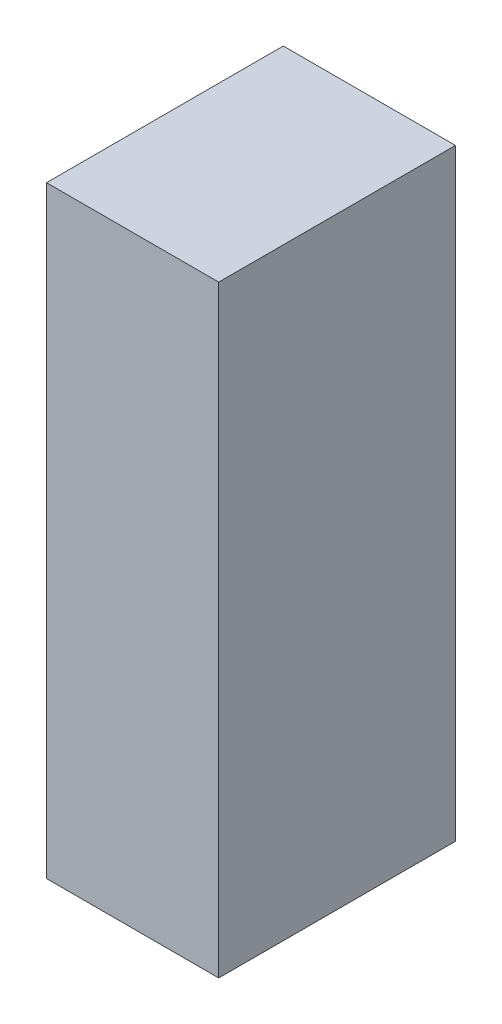
ISO-10303-21;
HEADER;
FILE_DESCRIPTION(('STEP AP214'),'2;1');
FILE_NAME('part.step','',(''),(''),'','','');
FILE_SCHEMA(('AUTOMOTIVE_DESIGN { 1 0 10303 214 1 1 1 1 }'));
ENDSEC;
DATA;
#1=APPLICATION_CONTEXT('core data for automotive mechanical design processes');
#2=APPLICATION_PROTOCOL_DEFINITION('international standard','automotive_design',2000,#1);
#3=PRODUCT_CONTEXT('',#1,'mechanical');
#4=PRODUCT('Part','Part','',(#3));
#5=PRODUCT_RELATED_PRODUCT_CATEGORY('part','',(#4));
#6=PRODUCT_DEFINITION_FORMATION('','',#4);
#7=PRODUCT_DEFINITION_CONTEXT('part definition',#1,'design');
#8=PRODUCT_DEFINITION('design','',#6,#7);
#9=PRODUCT_DEFINITION_SHAPE('','',#8);
#10=(LENGTH_UNIT() NAMED_UNIT(*) SI_UNIT(.MILLI.,.METRE.));
#11=(NAMED_UNIT(*) PLANE_ANGLE_UNIT() SI_UNIT($,.RADIAN.));
#12=(NAMED_UNIT(*) SI_UNIT($,.STERADIAN.) SOLID_ANGLE_UNIT());
#13=UNCERTAINTY_MEASURE_WITH_UNIT(LENGTH_MEASURE(1.E-05),#10,'distance_accuracy_value','');
#14=(GEOMETRIC_REPRESENTATION_CONTEXT(3) GLOBAL_UNCERTAINTY_ASSIGNED_CONTEXT((#13)) GLOBAL_UNIT_ASSIGNED_CONTEXT((#10,
#11,#12)) REPRESENTATION_CONTEXT('',''));
#15=CARTESIAN_POINT('',(0.,0.,0.));
#16=DIRECTION('',(0.,0.,1.));
#17=DIRECTION('',(1.,0.,0.));
#18=AXIS2_PLACEMENT_3D('',#15,#16,#17);
#19=CARTESIAN_POINT('',(-0.20000468,0.6999986,0.));
#20=DIRECTION('',(0.999999999993417,3.62859185820151E-06,0.));
#21=DIRECTION('',(-3.62859185820151E-06,0.999999999993417,0.));
#22=AXIS2_PLACEMENT_3D('',#19,#20,#21);
#23=PLANE('',#22);
#24=DIRECTION('',(0.,0.,1.));
#25=VECTOR('',#24,1.);
#26=CARTESIAN_POINT('',(-0.1999996,-0.69999352,0.));
#27=LINE('',#26,#25);
#28=CARTESIAN_POINT('',(-0.199999599999996,-0.69999352,0.));
#29=VERTEX_POINT('',#28);
#30=CARTESIAN_POINT('',(-0.199999599999996,-0.69999352,0.5499989));
#31=VERTEX_POINT('',#30);
#32=EDGE_CURVE('E62',#29,#31,#27,.T.);
#33=ORIENTED_EDGE('',*,*,#32,.T.);
#34=DIRECTION('',(-3.62859185820151E-06,0.999999999993417,0.));
#35=VECTOR('',#34,1.);
#36=CARTESIAN_POINT('',(-0.20000468,0.6999986,0.5499989));
#37=LINE('',#36,#35);
#38=CARTESIAN_POINT('',(-0.20000468,0.699998600000003,0.5499989));
#39=VERTEX_POINT('',#38);
#40=EDGE_CURVE('E70',#31,#39,#37,.T.);
#41=ORIENTED_EDGE('',*,*,#40,.T.);
#42=DIRECTION('',(0.,0.,1.));
#43=VECTOR('',#42,1.);
#44=CARTESIAN_POINT('',(-0.20000468,0.699998600000003,0.));
#45=LINE('',#44,#43);
#46=CARTESIAN_POINT('',(-0.20000468,0.699998600000003,0.));
#47=VERTEX_POINT('',#46);
#48=EDGE_CURVE('E68',#39,#47,#45,.F.);
#49=ORIENTED_EDGE('',*,*,#48,.T.);
#50=DIRECTION('',(-3.62859185820151E-06,0.999999999993417,0.));
#51=VECTOR('',#50,1.);
#52=CARTESIAN_POINT('',(-0.20000468,0.6999986,0.));
#53=LINE('',#52,#51);
#54=EDGE_CURVE('E69',#29,#47,#53,.T.);
#55=ORIENTED_EDGE('',*,*,#54,.F.);
#56=EDGE_LOOP('',(#33,#41,#49,#55));
#57=FACE_BOUND('',#56,.T.);
#58=ADVANCED_FACE('F17',(#57),#23,.F.);
#59=CARTESIAN_POINT('',(-0.1999996,-0.69999352,0.));
#60=DIRECTION('',(1.90497961767115E-05,0.999999999818553,0.));
#61=DIRECTION('',(-0.999999999818553,1.90497961767115E-05,0.));
#62=AXIS2_PLACEMENT_3D('',#59,#60,#61);
#63=PLANE('',#62);
#64=DIRECTION('',(0.,0.,1.));
#65=VECTOR('',#64,1.);
#66=CARTESIAN_POINT('',(0.20000468,-0.70000114,0.));
#67=LINE('',#66,#65);
#68=CARTESIAN_POINT('',(0.20000468,-0.700001140000003,0.));
#69=VERTEX_POINT('',#68);
#70=CARTESIAN_POINT('',(0.20000468,-0.700001140000003,0.5499989));
#71=VERTEX_POINT('',#70);
#72=EDGE_CURVE('E57',#69,#71,#67,.T.);
#73=ORIENTED_EDGE('',*,*,#72,.T.);
#74=DIRECTION('',(-0.999999999818553,1.90497961767115E-05,0.));
#75=VECTOR('',#74,1.);
#76=CARTESIAN_POINT('',(-0.1999996,-0.69999352,0.5499989));
#77=LINE('',#76,#75);
#78=EDGE_CURVE('E20',#71,#31,#77,.T.);
#79=ORIENTED_EDGE('',*,*,#78,.T.);
#80=ORIENTED_EDGE('',*,*,#32,.F.);
#81=DIRECTION('',(-0.999999999818553,1.90497961767115E-05,0.));
#82=VECTOR('',#81,1.);
#83=CARTESIAN_POINT('',(-0.1999996,-0.69999352,0.));
#84=LINE('',#83,#82);
#85=EDGE_CURVE('E76',#69,#29,#84,.T.);
#86=ORIENTED_EDGE('',*,*,#85,.F.);
#87=EDGE_LOOP('',(#73,#79,#80,#86));
#88=FACE_BOUND('',#87,.T.);
#89=ADVANCED_FACE('F89',(#88),#63,.F.);
#90=CARTESIAN_POINT('',(-0.20000468,0.6999986,0.5499989));
#91=DIRECTION('',(0.,0.,-1.));
#92=DIRECTION('',(-1.,0.,0.));
#93=AXIS2_PLACEMENT_3D('',#90,#91,#92);
#94=PLANE('',#93);
#95=ORIENTED_EDGE('',*,*,#78,.F.);
#96=DIRECTION('',(-3.62856551488351E-06,0.999999999993417,0.));
#97=VECTOR('',#96,1.);
#98=CARTESIAN_POINT('',(0.199999600003956,0.700000051441736,0.5499989));
#99=LINE('',#98,#97);
#100=CARTESIAN_POINT('',(0.199999600000006,0.70000114,0.5499989));
#101=VERTEX_POINT('',#100);
#102=EDGE_CURVE('E88',#71,#101,#99,.T.);
#103=ORIENTED_EDGE('',*,*,#102,.T.);
#104=DIRECTION('',(-0.999999999979839,-6.34993204809098E-06,0.));
#105=VECTOR('',#104,1.);
#106=CARTESIAN_POINT('',(-0.20000468,0.699998600000003,0.5499989));
#107=LINE('',#106,#105);
#108=EDGE_CURVE('E73',#101,#39,#107,.T.);
#109=ORIENTED_EDGE('',*,*,#108,.T.);
#110=ORIENTED_EDGE('',*,*,#40,.F.);
#111=EDGE_LOOP('',(#95,#103,#109,#110));
#112=FACE_BOUND('',#111,.T.);
#113=ADVANCED_FACE('F101',(#112),#94,.F.);
#114=CARTESIAN_POINT('',(0.1999996,0.70000114,0.));
#115=DIRECTION('',(6.34993204809098E-06,-0.999999999979839,0.));
#116=DIRECTION('',(0.999999999979839,6.34993204809098E-06,0.));
#117=AXIS2_PLACEMENT_3D('',#114,#115,#116);
#118=PLANE('',#117);
#119=ORIENTED_EDGE('',*,*,#48,.F.);
#120=ORIENTED_EDGE('',*,*,#108,.F.);
#121=DIRECTION('',(0.,0.,1.));
#122=VECTOR('',#121,1.);
#123=CARTESIAN_POINT('',(0.199999600000006,0.70000114,0.));
#124=LINE('',#123,#122);
#125=CARTESIAN_POINT('',(0.199999600000006,0.70000114,0.));
#126=VERTEX_POINT('',#125);
#127=EDGE_CURVE('E26',#101,#126,#124,.F.);
#128=ORIENTED_EDGE('',*,*,#127,.T.);
#129=DIRECTION('',(0.999999999979839,6.34993204809098E-06,0.));
#130=VECTOR('',#129,1.);
#131=CARTESIAN_POINT('',(0.1999996,0.70000114,0.));
#132=LINE('',#131,#130);
#133=EDGE_CURVE('E34',#47,#126,#132,.T.);
#134=ORIENTED_EDGE('',*,*,#133,.F.);
#135=EDGE_LOOP('',(#119,#120,#128,#134));
#136=FACE_BOUND('',#135,.T.);
#137=ADVANCED_FACE('F79',(#136),#118,.F.);
#138=CARTESIAN_POINT('',(-0.20000468,0.6999986,0.));
#139=DIRECTION('',(0.,0.,-1.));
#140=DIRECTION('',(-1.,0.,0.));
#141=AXIS2_PLACEMENT_3D('',#138,#139,#140);
#142=PLANE('',#141);
#143=ORIENTED_EDGE('',*,*,#85,.T.);
#144=ORIENTED_EDGE('',*,*,#54,.T.);
#145=ORIENTED_EDGE('',*,*,#133,.T.);
#146=DIRECTION('',(3.62856551488351E-06,-0.999999999993417,0.));
#147=VECTOR('',#146,1.);
#148=CARTESIAN_POINT('',(0.20000468,-0.70000114,0.));
#149=LINE('',#148,#147);
#150=EDGE_CURVE('E11',#126,#69,#149,.T.);
#151=ORIENTED_EDGE('',*,*,#150,.T.);
#152=EDGE_LOOP('',(#143,#144,#145,#151));
#153=FACE_BOUND('',#152,.T.);
#154=ADVANCED_FACE('F75',(#153),#142,.T.);
#155=CARTESIAN_POINT('',(0.20000468,-0.70000114,0.));
#156=DIRECTION('',(-0.999999999993417,-3.62856551488351E-06,0.));
#157=DIRECTION('',(3.62856551488351E-06,-0.999999999993417,0.));
#158=AXIS2_PLACEMENT_3D('',#155,#156,#157);
#159=PLANE('',#158);
#160=ORIENTED_EDGE('',*,*,#127,.F.);
#161=ORIENTED_EDGE('',*,*,#102,.F.);
#162=ORIENTED_EDGE('',*,*,#72,.F.);
#163=ORIENTED_EDGE('',*,*,#150,.F.);
#164=EDGE_LOOP('',(#160,#161,#162,#163));
#165=FACE_BOUND('',#164,.T.);
#166=ADVANCED_FACE('F90',(#165),#159,.F.);
#167=CLOSED_SHELL('',(#58,#89,#113,#137,#154,#166));
#168=MANIFOLD_SOLID_BREP('B1',#167);
#169=ADVANCED_BREP_SHAPE_REPRESENTATION('',(#18,#168),#14);
#170=SHAPE_DEFINITION_REPRESENTATION(#9,#169);
ENDSEC;
END-ISO-10303-21;
